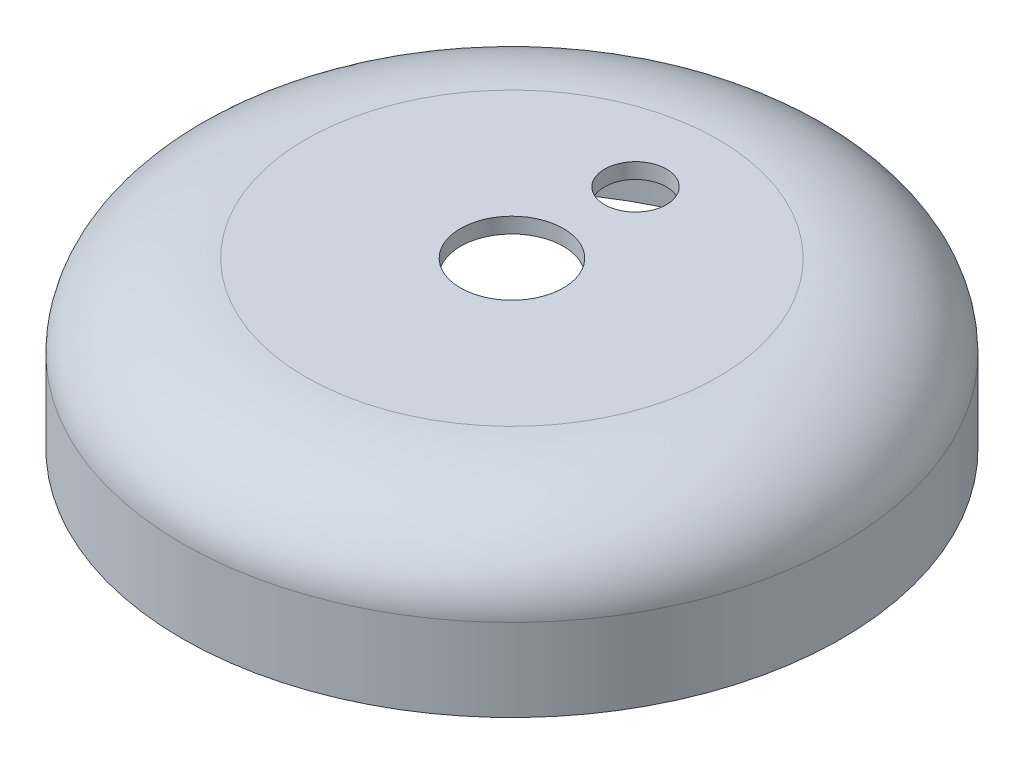
ISO-10303-21;
HEADER;
FILE_DESCRIPTION(('STEP AP214'),'2;1');
FILE_NAME('part.step','',(''),(''),'','','');
FILE_SCHEMA(('AUTOMOTIVE_DESIGN { 1 0 10303 214 1 1 1 1 }'));
ENDSEC;
DATA;
#1=APPLICATION_CONTEXT('core data for automotive mechanical design processes');
#2=APPLICATION_PROTOCOL_DEFINITION('international standard','automotive_design',2000,#1);
#3=PRODUCT_CONTEXT('',#1,'mechanical');
#4=PRODUCT('Part','Part','',(#3));
#5=PRODUCT_RELATED_PRODUCT_CATEGORY('part','',(#4));
#6=PRODUCT_DEFINITION_FORMATION('','',#4);
#7=PRODUCT_DEFINITION_CONTEXT('part definition',#1,'design');
#8=PRODUCT_DEFINITION('design','',#6,#7);
#9=PRODUCT_DEFINITION_SHAPE('','',#8);
#10=(LENGTH_UNIT() NAMED_UNIT(*) SI_UNIT(.MILLI.,.METRE.));
#11=(NAMED_UNIT(*) PLANE_ANGLE_UNIT() SI_UNIT($,.RADIAN.));
#12=(NAMED_UNIT(*) SI_UNIT($,.STERADIAN.) SOLID_ANGLE_UNIT());
#13=UNCERTAINTY_MEASURE_WITH_UNIT(LENGTH_MEASURE(1.E-05),#10,'distance_accuracy_value','');
#14=(GEOMETRIC_REPRESENTATION_CONTEXT(3) GLOBAL_UNCERTAINTY_ASSIGNED_CONTEXT((#13)) GLOBAL_UNIT_ASSIGNED_CONTEXT((#10,
#11,#12)) REPRESENTATION_CONTEXT('',''));
#15=CARTESIAN_POINT('',(0.,0.,0.));
#16=DIRECTION('',(0.,0.,1.));
#17=DIRECTION('',(1.,0.,0.));
#18=AXIS2_PLACEMENT_3D('',#15,#16,#17);
#19=CARTESIAN_POINT('',(0.,0.,0.));
#20=DIRECTION('',(0.,-1.,0.));
#21=DIRECTION('',(0.,0.,-1.));
#22=AXIS2_PLACEMENT_3D('',#19,#20,#21);
#23=PLANE('',#22);
#24=CARTESIAN_POINT('',(0.,0.,-38.1));
#25=DIRECTION('',(0.,1.,0.));
#26=DIRECTION('',(0.,0.,1.));
#27=AXIS2_PLACEMENT_3D('',#24,#25,#26);
#28=CIRCLE('',#27,9.525);
#29=CARTESIAN_POINT('',(0.,0.,-28.575));
#30=VERTEX_POINT('',#29);
#31=EDGE_CURVE('E48',#30,#30,#28,.T.);
#32=ORIENTED_EDGE('',*,*,#31,.F.);
#33=EDGE_LOOP('',(#32));
#34=FACE_BOUND('',#33,.T.);
#35=CARTESIAN_POINT('',(0.,0.,0.));
#36=DIRECTION('',(0.,1.,0.));
#37=DIRECTION('',(0.,0.,1.));
#38=AXIS2_PLACEMENT_3D('',#35,#36,#37);
#39=CIRCLE('',#38,15.875);
#40=CARTESIAN_POINT('',(0.,0.,15.875));
#41=VERTEX_POINT('',#40);
#42=EDGE_CURVE('E54',#41,#41,#39,.T.);
#43=ORIENTED_EDGE('',*,*,#42,.F.);
#44=EDGE_LOOP('',(#43));
#45=FACE_BOUND('',#44,.T.);
#46=CARTESIAN_POINT('',(0.,0.,0.));
#47=DIRECTION('',(0.,1.,0.));
#48=DIRECTION('',(0.,0.,1.));
#49=AXIS2_PLACEMENT_3D('',#46,#47,#48);
#50=CIRCLE('',#49,63.5);
#51=CARTESIAN_POINT('',(0.,0.,63.5));
#52=VERTEX_POINT('',#51);
#53=EDGE_CURVE('E10',#52,#52,#50,.T.);
#54=ORIENTED_EDGE('',*,*,#53,.T.);
#55=EDGE_LOOP('',(#54));
#56=FACE_BOUND('',#55,.T.);
#57=ADVANCED_FACE('F31',(#34,#45,#56),#23,.F.);
#58=CARTESIAN_POINT('',(63.5,-25.4,0.));
#59=DIRECTION('',(0.,0.,1.));
#60=DIRECTION('',(-1.,0.,0.));
#61=AXIS2_PLACEMENT_3D('',#58,#59,#60);
#62=ELLIPSE('',#61,38.1,25.4);
#63=CARTESIAN_POINT('',(0.,29.511089747257,0.));
#64=DIRECTION('',(0.,1.,0.));
#65=AXIS1_PLACEMENT('',#63,#64);
#66=SURFACE_OF_REVOLUTION('',#62,#65);
#67=ORIENTED_EDGE('',*,*,#53,.F.);
#68=EDGE_LOOP('',(#67));
#69=FACE_BOUND('',#68,.T.);
#70=CARTESIAN_POINT('',(0.,-25.4,0.));
#71=DIRECTION('',(0.,1.,0.));
#72=DIRECTION('',(0.,0.,1.));
#73=AXIS2_PLACEMENT_3D('',#70,#71,#72);
#74=CIRCLE('',#73,101.6);
#75=CARTESIAN_POINT('',(0.,-25.4,101.6));
#76=VERTEX_POINT('',#75);
#77=EDGE_CURVE('E38',#76,#76,#74,.T.);
#78=ORIENTED_EDGE('',*,*,#77,.T.);
#79=EDGE_LOOP('',(#78));
#80=FACE_BOUND('',#79,.T.);
#81=ADVANCED_FACE('F83',(#69,#80),#66,.T.);
#82=CARTESIAN_POINT('',(0.,29.511089747257,0.));
#83=DIRECTION('',(0.,1.,0.));
#84=DIRECTION('',(0.,0.,1.));
#85=AXIS2_PLACEMENT_3D('',#82,#83,#84);
#86=CYLINDRICAL_SURFACE('',#85,101.6);
#87=ORIENTED_EDGE('',*,*,#77,.F.);
#88=EDGE_LOOP('',(#87));
#89=FACE_BOUND('',#88,.T.);
#90=CARTESIAN_POINT('',(0.,-50.8,0.));
#91=DIRECTION('',(0.,1.,0.));
#92=DIRECTION('',(0.,0.,1.));
#93=AXIS2_PLACEMENT_3D('',#90,#91,#92);
#94=CIRCLE('',#93,101.6);
#95=CARTESIAN_POINT('',(0.,-50.8,101.6));
#96=VERTEX_POINT('',#95);
#97=EDGE_CURVE('E43',#96,#96,#94,.T.);
#98=ORIENTED_EDGE('',*,*,#97,.T.);
#99=EDGE_LOOP('',(#98));
#100=FACE_BOUND('',#99,.T.);
#101=ADVANCED_FACE('F80',(#89,#100),#86,.T.);
#102=CARTESIAN_POINT('',(96.8375,-50.8,0.));
#103=DIRECTION('',(0.,1.,0.));
#104=DIRECTION('',(0.,0.,1.));
#105=AXIS2_PLACEMENT_3D('',#102,#103,#104);
#106=PLANE('',#105);
#107=ORIENTED_EDGE('',*,*,#97,.F.);
#108=EDGE_LOOP('',(#107));
#109=FACE_BOUND('',#108,.T.);
#110=CARTESIAN_POINT('',(0.,-50.8,0.));
#111=DIRECTION('',(0.,1.,0.));
#112=DIRECTION('',(0.,0.,1.));
#113=AXIS2_PLACEMENT_3D('',#110,#111,#112);
#114=CIRCLE('',#113,96.8375);
#115=CARTESIAN_POINT('',(0.,-50.8,96.8375));
#116=VERTEX_POINT('',#115);
#117=EDGE_CURVE('E96',#116,#116,#114,.T.);
#118=ORIENTED_EDGE('',*,*,#117,.T.);
#119=EDGE_LOOP('',(#118));
#120=FACE_BOUND('',#119,.T.);
#121=ADVANCED_FACE('F76',(#109,#120),#106,.F.);
#122=CARTESIAN_POINT('',(0.,29.511089747257,0.));
#123=DIRECTION('',(0.,1.,0.));
#124=DIRECTION('',(0.,0.,1.));
#125=AXIS2_PLACEMENT_3D('',#122,#123,#124);
#126=CYLINDRICAL_SURFACE('',#125,96.8375);
#127=ORIENTED_EDGE('',*,*,#117,.F.);
#128=EDGE_LOOP('',(#127));
#129=FACE_BOUND('',#128,.T.);
#130=CARTESIAN_POINT('',(0.,-25.4,0.));
#131=DIRECTION('',(0.,1.,0.));
#132=DIRECTION('',(0.,0.,1.));
#133=AXIS2_PLACEMENT_3D('',#130,#131,#132);
#134=CIRCLE('',#133,96.8375);
#135=CARTESIAN_POINT('',(0.,-25.4,96.8375));
#136=VERTEX_POINT('',#135);
#137=EDGE_CURVE('E98',#136,#136,#134,.T.);
#138=ORIENTED_EDGE('',*,*,#137,.T.);
#139=EDGE_LOOP('',(#138));
#140=FACE_BOUND('',#139,.T.);
#141=ADVANCED_FACE('F71',(#129,#140),#126,.F.);
#142=CARTESIAN_POINT('',(63.5,-25.4,0.));
#143=DIRECTION('',(0.,0.,-1.));
#144=DIRECTION('',(1.,0.,0.));
#145=AXIS2_PLACEMENT_3D('',#142,#143,#144);
#146=ELLIPSE('',#145,33.3375,20.6375);
#147=CARTESIAN_POINT('',(0.,29.511089747257,0.));
#148=DIRECTION('',(0.,1.,0.));
#149=AXIS1_PLACEMENT('',#147,#148);
#150=SURFACE_OF_REVOLUTION('',#146,#149);
#151=ORIENTED_EDGE('',*,*,#137,.F.);
#152=EDGE_LOOP('',(#151));
#153=FACE_BOUND('',#152,.T.);
#154=CARTESIAN_POINT('',(0.,-4.7625,0.));
#155=DIRECTION('',(0.,1.,0.));
#156=DIRECTION('',(0.,0.,1.));
#157=AXIS2_PLACEMENT_3D('',#154,#155,#156);
#158=CIRCLE('',#157,63.5);
#159=CARTESIAN_POINT('',(0.,-4.7625,63.5));
#160=VERTEX_POINT('',#159);
#161=EDGE_CURVE('E52',#160,#160,#158,.T.);
#162=ORIENTED_EDGE('',*,*,#161,.T.);
#163=EDGE_LOOP('',(#162));
#164=FACE_BOUND('',#163,.T.);
#165=ADVANCED_FACE('F66',(#153,#164),#150,.T.);
#166=CARTESIAN_POINT('',(0.,-4.7625,0.));
#167=DIRECTION('',(0.,1.,0.));
#168=DIRECTION('',(0.,0.,1.));
#169=AXIS2_PLACEMENT_3D('',#166,#167,#168);
#170=PLANE('',#169);
#171=CARTESIAN_POINT('',(0.,-4.7625,-38.1));
#172=DIRECTION('',(0.,1.,0.));
#173=DIRECTION('',(0.,0.,1.));
#174=AXIS2_PLACEMENT_3D('',#171,#172,#173);
#175=CIRCLE('',#174,9.525);
#176=CARTESIAN_POINT('',(0.,-4.7625,-28.575));
#177=VERTEX_POINT('',#176);
#178=EDGE_CURVE('E34',#177,#177,#175,.T.);
#179=ORIENTED_EDGE('',*,*,#178,.T.);
#180=EDGE_LOOP('',(#179));
#181=FACE_BOUND('',#180,.T.);
#182=CARTESIAN_POINT('',(0.,-4.7625,0.));
#183=DIRECTION('',(0.,1.,0.));
#184=DIRECTION('',(0.,0.,1.));
#185=AXIS2_PLACEMENT_3D('',#182,#183,#184);
#186=CIRCLE('',#185,15.875);
#187=CARTESIAN_POINT('',(0.,-4.7625,15.875));
#188=VERTEX_POINT('',#187);
#189=EDGE_CURVE('E46',#188,#188,#186,.T.);
#190=ORIENTED_EDGE('',*,*,#189,.T.);
#191=EDGE_LOOP('',(#190));
#192=FACE_BOUND('',#191,.T.);
#193=ORIENTED_EDGE('',*,*,#161,.F.);
#194=EDGE_LOOP('',(#193));
#195=FACE_BOUND('',#194,.T.);
#196=ADVANCED_FACE('F70',(#181,#192,#195),#170,.F.);
#197=CARTESIAN_POINT('',(0.,-25.4,0.));
#198=DIRECTION('',(0.,1.,0.));
#199=DIRECTION('',(0.,0.,1.));
#200=AXIS2_PLACEMENT_3D('',#197,#198,#199);
#201=CYLINDRICAL_SURFACE('',#200,15.875);
#202=ORIENTED_EDGE('',*,*,#42,.T.);
#203=EDGE_LOOP('',(#202));
#204=FACE_BOUND('',#203,.T.);
#205=ORIENTED_EDGE('',*,*,#189,.F.);
#206=EDGE_LOOP('',(#205));
#207=FACE_BOUND('',#206,.T.);
#208=ADVANCED_FACE('F107',(#204,#207),#201,.F.);
#209=CARTESIAN_POINT('',(0.,-25.4,-38.1));
#210=DIRECTION('',(0.,1.,0.));
#211=DIRECTION('',(0.,0.,1.));
#212=AXIS2_PLACEMENT_3D('',#209,#210,#211);
#213=CYLINDRICAL_SURFACE('',#212,9.525);
#214=ORIENTED_EDGE('',*,*,#31,.T.);
#215=EDGE_LOOP('',(#214));
#216=FACE_BOUND('',#215,.T.);
#217=ORIENTED_EDGE('',*,*,#178,.F.);
#218=EDGE_LOOP('',(#217));
#219=FACE_BOUND('',#218,.T.);
#220=ADVANCED_FACE('F112',(#216,#219),#213,.F.);
#221=CLOSED_SHELL('',(#57,#81,#101,#121,#141,#165,#196,#208,#220));
#222=MANIFOLD_SOLID_BREP('B2',#221);
#223=ADVANCED_BREP_SHAPE_REPRESENTATION('',(#18,#222),#14);
#224=SHAPE_DEFINITION_REPRESENTATION(#9,#223);
ENDSEC;
END-ISO-10303-21;
